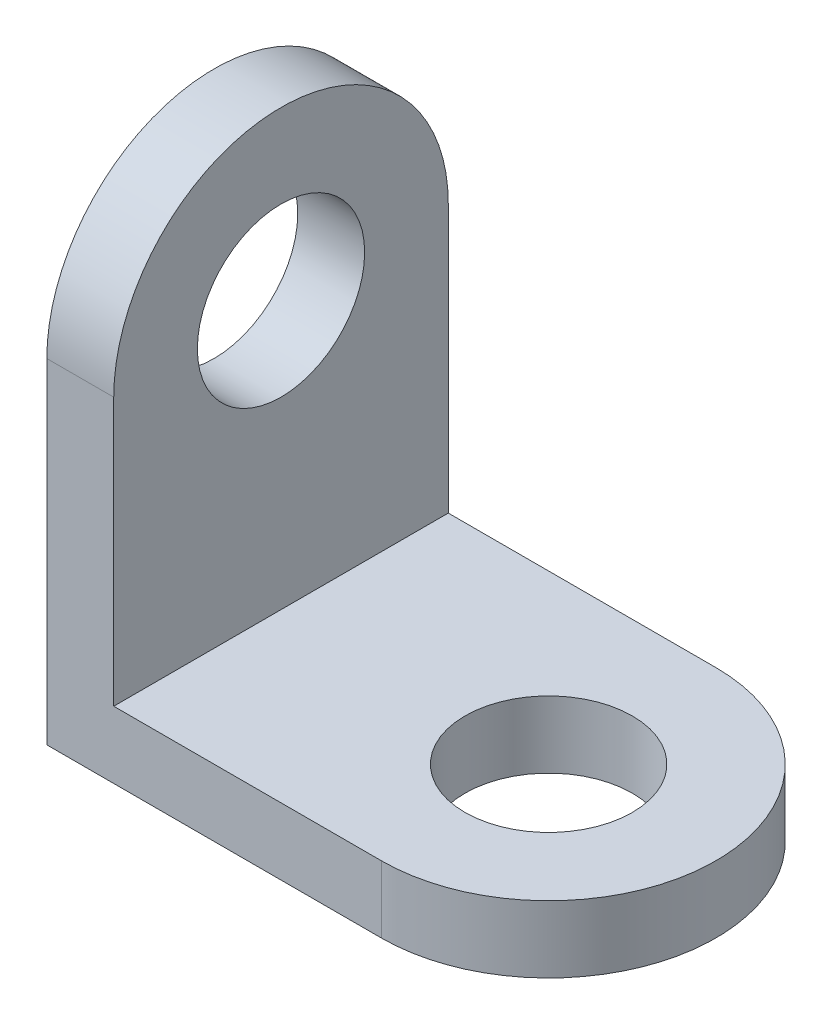
ISO-10303-21;
HEADER;
FILE_DESCRIPTION(('STEP AP214'),'2;1');
FILE_NAME('part.step','',(''),(''),'','','');
FILE_SCHEMA(('AUTOMOTIVE_DESIGN { 1 0 10303 214 1 1 1 1 }'));
ENDSEC;
DATA;
#1=APPLICATION_CONTEXT('core data for automotive mechanical design processes');
#2=APPLICATION_PROTOCOL_DEFINITION('international standard','automotive_design',2000,#1);
#3=PRODUCT_CONTEXT('',#1,'mechanical');
#4=PRODUCT('Part','Part','',(#3));
#5=PRODUCT_RELATED_PRODUCT_CATEGORY('part','',(#4));
#6=PRODUCT_DEFINITION_FORMATION('','',#4);
#7=PRODUCT_DEFINITION_CONTEXT('part definition',#1,'design');
#8=PRODUCT_DEFINITION('design','',#6,#7);
#9=PRODUCT_DEFINITION_SHAPE('','',#8);
#10=(LENGTH_UNIT() NAMED_UNIT(*) SI_UNIT(.MILLI.,.METRE.));
#11=(NAMED_UNIT(*) PLANE_ANGLE_UNIT() SI_UNIT($,.RADIAN.));
#12=(NAMED_UNIT(*) SI_UNIT($,.STERADIAN.) SOLID_ANGLE_UNIT());
#13=UNCERTAINTY_MEASURE_WITH_UNIT(LENGTH_MEASURE(1.E-05),#10,'distance_accuracy_value','');
#14=(GEOMETRIC_REPRESENTATION_CONTEXT(3) GLOBAL_UNCERTAINTY_ASSIGNED_CONTEXT((#13)) GLOBAL_UNIT_ASSIGNED_CONTEXT((#10,
#11,#12)) REPRESENTATION_CONTEXT('',''));
#15=CARTESIAN_POINT('',(0.,0.,0.));
#16=DIRECTION('',(0.,0.,1.));
#17=DIRECTION('',(1.,0.,0.));
#18=AXIS2_PLACEMENT_3D('',#15,#16,#17);
#19=CARTESIAN_POINT('',(0.,2.,0.));
#20=DIRECTION('',(0.,1.,0.));
#21=DIRECTION('',(0.,0.,1.));
#22=AXIS2_PLACEMENT_3D('',#19,#20,#21);
#23=PLANE('',#22);
#24=DIRECTION('',(0.,0.,-1.));
#25=VECTOR('',#24,1.);
#26=CARTESIAN_POINT('',(-8.,2.,0.));
#27=LINE('',#26,#25);
#28=CARTESIAN_POINT('',(-8.,2.,5.));
#29=VERTEX_POINT('',#28);
#30=CARTESIAN_POINT('',(-8.,2.,-5.));
#31=VERTEX_POINT('',#30);
#32=EDGE_CURVE('E66',#29,#31,#27,.T.);
#33=ORIENTED_EDGE('',*,*,#32,.F.);
#34=DIRECTION('',(1.,0.,0.));
#35=VECTOR('',#34,1.);
#36=CARTESIAN_POINT('',(0.,2.,5.));
#37=LINE('',#36,#35);
#38=CARTESIAN_POINT('',(0.,2.,5.));
#39=VERTEX_POINT('',#38);
#40=EDGE_CURVE('E105',#29,#39,#37,.T.);
#41=ORIENTED_EDGE('',*,*,#40,.T.);
#42=CARTESIAN_POINT('',(0.,2.,0.));
#43=DIRECTION('',(0.,1.,0.));
#44=DIRECTION('',(0.,0.,1.));
#45=AXIS2_PLACEMENT_3D('',#42,#43,#44);
#46=CIRCLE('',#45,5.);
#47=CARTESIAN_POINT('',(0.,2.,-5.));
#48=VERTEX_POINT('',#47);
#49=EDGE_CURVE('E72',#39,#48,#46,.T.);
#50=ORIENTED_EDGE('',*,*,#49,.T.);
#51=DIRECTION('',(-1.,0.,0.));
#52=VECTOR('',#51,1.);
#53=CARTESIAN_POINT('',(0.,2.,-5.));
#54=LINE('',#53,#52);
#55=EDGE_CURVE('E116',#48,#31,#54,.T.);
#56=ORIENTED_EDGE('',*,*,#55,.T.);
#57=EDGE_LOOP('',(#33,#41,#50,#56));
#58=FACE_BOUND('',#57,.T.);
#59=CARTESIAN_POINT('',(0.,2.,0.));
#60=DIRECTION('',(0.,1.,0.));
#61=DIRECTION('',(0.,0.,1.));
#62=AXIS2_PLACEMENT_3D('',#59,#60,#61);
#63=CIRCLE('',#62,2.5);
#64=CARTESIAN_POINT('',(0.,2.,2.5));
#65=VERTEX_POINT('',#64);
#66=EDGE_CURVE('E121',#65,#65,#63,.T.);
#67=ORIENTED_EDGE('',*,*,#66,.F.);
#68=EDGE_LOOP('',(#67));
#69=FACE_BOUND('',#68,.T.);
#70=ADVANCED_FACE('F49',(#58,#69),#23,.T.);
#71=CARTESIAN_POINT('',(0.,0.,0.));
#72=DIRECTION('',(0.,1.,0.));
#73=DIRECTION('',(0.,0.,1.));
#74=AXIS2_PLACEMENT_3D('',#71,#72,#73);
#75=PLANE('',#74);
#76=DIRECTION('',(1.,0.,0.));
#77=VECTOR('',#76,1.);
#78=CARTESIAN_POINT('',(0.,0.,5.));
#79=LINE('',#78,#77);
#80=CARTESIAN_POINT('',(-10.,0.,5.));
#81=VERTEX_POINT('',#80);
#82=CARTESIAN_POINT('',(0.,0.,5.));
#83=VERTEX_POINT('',#82);
#84=EDGE_CURVE('E111',#81,#83,#79,.T.);
#85=ORIENTED_EDGE('',*,*,#84,.F.);
#86=DIRECTION('',(0.,0.,1.));
#87=VECTOR('',#86,1.);
#88=CARTESIAN_POINT('',(-10.,0.,0.));
#89=LINE('',#88,#87);
#90=CARTESIAN_POINT('',(-10.,0.,-5.));
#91=VERTEX_POINT('',#90);
#92=EDGE_CURVE('E92',#91,#81,#89,.T.);
#93=ORIENTED_EDGE('',*,*,#92,.F.);
#94=DIRECTION('',(-1.,0.,0.));
#95=VECTOR('',#94,1.);
#96=CARTESIAN_POINT('',(0.,0.,-5.));
#97=LINE('',#96,#95);
#98=CARTESIAN_POINT('',(0.,0.,-5.));
#99=VERTEX_POINT('',#98);
#100=EDGE_CURVE('E106',#99,#91,#97,.T.);
#101=ORIENTED_EDGE('',*,*,#100,.F.);
#102=CARTESIAN_POINT('',(0.,0.,0.));
#103=DIRECTION('',(0.,1.,0.));
#104=DIRECTION('',(0.,0.,1.));
#105=AXIS2_PLACEMENT_3D('',#102,#103,#104);
#106=CIRCLE('',#105,5.);
#107=EDGE_CURVE('E120',#83,#99,#106,.T.);
#108=ORIENTED_EDGE('',*,*,#107,.F.);
#109=EDGE_LOOP('',(#85,#93,#101,#108));
#110=FACE_BOUND('',#109,.T.);
#111=CARTESIAN_POINT('',(0.,0.,0.));
#112=DIRECTION('',(0.,1.,0.));
#113=DIRECTION('',(0.,0.,1.));
#114=AXIS2_PLACEMENT_3D('',#111,#112,#113);
#115=CIRCLE('',#114,2.5);
#116=CARTESIAN_POINT('',(0.,0.,2.5));
#117=VERTEX_POINT('',#116);
#118=EDGE_CURVE('E125',#117,#117,#115,.T.);
#119=ORIENTED_EDGE('',*,*,#118,.T.);
#120=EDGE_LOOP('',(#119));
#121=FACE_BOUND('',#120,.T.);
#122=ADVANCED_FACE('F118',(#110,#121),#75,.F.);
#123=CARTESIAN_POINT('',(0.,2.,5.));
#124=DIRECTION('',(0.,0.,-1.));
#125=DIRECTION('',(-1.,0.,0.));
#126=AXIS2_PLACEMENT_3D('',#123,#124,#125);
#127=PLANE('',#126);
#128=ORIENTED_EDGE('',*,*,#84,.T.);
#129=DIRECTION('',(0.,-1.,0.));
#130=VECTOR('',#129,1.);
#131=CARTESIAN_POINT('',(0.,2.,5.));
#132=LINE('',#131,#130);
#133=EDGE_CURVE('E12',#39,#83,#132,.T.);
#134=ORIENTED_EDGE('',*,*,#133,.F.);
#135=ORIENTED_EDGE('',*,*,#40,.F.);
#136=DIRECTION('',(0.,-1.,0.));
#137=VECTOR('',#136,1.);
#138=CARTESIAN_POINT('',(-8.,0.,5.));
#139=LINE('',#138,#137);
#140=CARTESIAN_POINT('',(-8.,10.,5.));
#141=VERTEX_POINT('',#140);
#142=EDGE_CURVE('E154',#141,#29,#139,.T.);
#143=ORIENTED_EDGE('',*,*,#142,.F.);
#144=DIRECTION('',(-1.,0.,0.));
#145=VECTOR('',#144,1.);
#146=CARTESIAN_POINT('',(-8.,10.,5.));
#147=LINE('',#146,#145);
#148=CARTESIAN_POINT('',(-10.,10.,5.));
#149=VERTEX_POINT('',#148);
#150=EDGE_CURVE('E114',#141,#149,#147,.T.);
#151=ORIENTED_EDGE('',*,*,#150,.T.);
#152=DIRECTION('',(0.,-1.,0.));
#153=VECTOR('',#152,1.);
#154=CARTESIAN_POINT('',(-10.,2.,5.));
#155=LINE('',#154,#153);
#156=EDGE_CURVE('E98',#149,#81,#155,.T.);
#157=ORIENTED_EDGE('',*,*,#156,.T.);
#158=EDGE_LOOP('',(#128,#134,#135,#143,#151,#157));
#159=FACE_BOUND('',#158,.T.);
#160=ADVANCED_FACE('F51',(#159),#127,.F.);
#161=CARTESIAN_POINT('',(0.,2.,0.));
#162=DIRECTION('',(0.,-1.,0.));
#163=DIRECTION('',(0.,0.,-1.));
#164=AXIS2_PLACEMENT_3D('',#161,#162,#163);
#165=CYLINDRICAL_SURFACE('',#164,5.);
#166=ORIENTED_EDGE('',*,*,#107,.T.);
#167=DIRECTION('',(0.,-1.,0.));
#168=VECTOR('',#167,1.);
#169=CARTESIAN_POINT('',(0.,2.,-5.));
#170=LINE('',#169,#168);
#171=EDGE_CURVE('E58',#48,#99,#170,.T.);
#172=ORIENTED_EDGE('',*,*,#171,.F.);
#173=ORIENTED_EDGE('',*,*,#49,.F.);
#174=ORIENTED_EDGE('',*,*,#133,.T.);
#175=EDGE_LOOP('',(#166,#172,#173,#174));
#176=FACE_BOUND('',#175,.T.);
#177=ADVANCED_FACE('F203',(#176),#165,.T.);
#178=CARTESIAN_POINT('',(0.,2.,-5.));
#179=DIRECTION('',(0.,0.,1.));
#180=DIRECTION('',(1.,0.,0.));
#181=AXIS2_PLACEMENT_3D('',#178,#179,#180);
#182=PLANE('',#181);
#183=ORIENTED_EDGE('',*,*,#100,.T.);
#184=DIRECTION('',(0.,-1.,0.));
#185=VECTOR('',#184,1.);
#186=CARTESIAN_POINT('',(-10.,2.,-5.));
#187=LINE('',#186,#185);
#188=CARTESIAN_POINT('',(-10.,10.,-5.));
#189=VERTEX_POINT('',#188);
#190=EDGE_CURVE('E101',#189,#91,#187,.T.);
#191=ORIENTED_EDGE('',*,*,#190,.F.);
#192=DIRECTION('',(-1.,0.,0.));
#193=VECTOR('',#192,1.);
#194=CARTESIAN_POINT('',(-8.,10.,-5.));
#195=LINE('',#194,#193);
#196=CARTESIAN_POINT('',(-8.,10.,-5.));
#197=VERTEX_POINT('',#196);
#198=EDGE_CURVE('E158',#197,#189,#195,.T.);
#199=ORIENTED_EDGE('',*,*,#198,.F.);
#200=DIRECTION('',(0.,1.,0.));
#201=VECTOR('',#200,1.);
#202=CARTESIAN_POINT('',(-8.,0.,-5.));
#203=LINE('',#202,#201);
#204=EDGE_CURVE('E152',#31,#197,#203,.T.);
#205=ORIENTED_EDGE('',*,*,#204,.F.);
#206=ORIENTED_EDGE('',*,*,#55,.F.);
#207=ORIENTED_EDGE('',*,*,#171,.T.);
#208=EDGE_LOOP('',(#183,#191,#199,#205,#206,#207));
#209=FACE_BOUND('',#208,.T.);
#210=ADVANCED_FACE('F156',(#209),#182,.F.);
#211=CARTESIAN_POINT('',(-10.,2.,0.));
#212=DIRECTION('',(1.,0.,0.));
#213=DIRECTION('',(0.,0.,-1.));
#214=AXIS2_PLACEMENT_3D('',#211,#212,#213);
#215=PLANE('',#214);
#216=ORIENTED_EDGE('',*,*,#92,.T.);
#217=ORIENTED_EDGE('',*,*,#156,.F.);
#218=CARTESIAN_POINT('',(-10.,10.,0.));
#219=DIRECTION('',(-1.,0.,0.));
#220=DIRECTION('',(0.,0.,1.));
#221=AXIS2_PLACEMENT_3D('',#218,#219,#220);
#222=CIRCLE('',#221,5.);
#223=EDGE_CURVE('E168',#149,#189,#222,.T.);
#224=ORIENTED_EDGE('',*,*,#223,.T.);
#225=ORIENTED_EDGE('',*,*,#190,.T.);
#226=EDGE_LOOP('',(#216,#217,#224,#225));
#227=FACE_BOUND('',#226,.T.);
#228=CARTESIAN_POINT('',(-10.,10.,0.));
#229=DIRECTION('',(-1.,0.,0.));
#230=DIRECTION('',(0.,0.,1.));
#231=AXIS2_PLACEMENT_3D('',#228,#229,#230);
#232=CIRCLE('',#231,2.5);
#233=CARTESIAN_POINT('',(-10.,10.,2.5));
#234=VERTEX_POINT('',#233);
#235=EDGE_CURVE('E166',#234,#234,#232,.T.);
#236=ORIENTED_EDGE('',*,*,#235,.F.);
#237=EDGE_LOOP('',(#236));
#238=FACE_BOUND('',#237,.T.);
#239=ADVANCED_FACE('F94',(#227,#238),#215,.F.);
#240=CARTESIAN_POINT('',(0.,2.,0.));
#241=DIRECTION('',(0.,-1.,0.));
#242=DIRECTION('',(0.,0.,-1.));
#243=AXIS2_PLACEMENT_3D('',#240,#241,#242);
#244=CYLINDRICAL_SURFACE('',#243,2.5);
#245=ORIENTED_EDGE('',*,*,#66,.T.);
#246=EDGE_LOOP('',(#245));
#247=FACE_BOUND('',#246,.T.);
#248=ORIENTED_EDGE('',*,*,#118,.F.);
#249=EDGE_LOOP('',(#248));
#250=FACE_BOUND('',#249,.T.);
#251=ADVANCED_FACE('F189',(#247,#250),#244,.F.);
#252=CARTESIAN_POINT('',(-8.,10.,0.));
#253=DIRECTION('',(-1.,0.,0.));
#254=DIRECTION('',(0.,0.,1.));
#255=AXIS2_PLACEMENT_3D('',#252,#253,#254);
#256=CYLINDRICAL_SURFACE('',#255,5.);
#257=ORIENTED_EDGE('',*,*,#223,.F.);
#258=ORIENTED_EDGE('',*,*,#150,.F.);
#259=CARTESIAN_POINT('',(-8.,10.,0.));
#260=DIRECTION('',(-1.,0.,0.));
#261=DIRECTION('',(0.,0.,1.));
#262=AXIS2_PLACEMENT_3D('',#259,#260,#261);
#263=CIRCLE('',#262,5.);
#264=EDGE_CURVE('E160',#141,#197,#263,.T.);
#265=ORIENTED_EDGE('',*,*,#264,.T.);
#266=ORIENTED_EDGE('',*,*,#198,.T.);
#267=EDGE_LOOP('',(#257,#258,#265,#266));
#268=FACE_BOUND('',#267,.T.);
#269=ADVANCED_FACE('F182',(#268),#256,.T.);
#270=CARTESIAN_POINT('',(-8.,10.,0.));
#271=DIRECTION('',(-1.,0.,0.));
#272=DIRECTION('',(0.,0.,1.));
#273=AXIS2_PLACEMENT_3D('',#270,#271,#272);
#274=CYLINDRICAL_SURFACE('',#273,2.5);
#275=CARTESIAN_POINT('',(-8.,10.,0.));
#276=DIRECTION('',(-1.,0.,0.));
#277=DIRECTION('',(0.,0.,1.));
#278=AXIS2_PLACEMENT_3D('',#275,#276,#277);
#279=CIRCLE('',#278,2.5);
#280=CARTESIAN_POINT('',(-8.,10.,2.5));
#281=VERTEX_POINT('',#280);
#282=EDGE_CURVE('E155',#281,#281,#279,.T.);
#283=ORIENTED_EDGE('',*,*,#282,.F.);
#284=EDGE_LOOP('',(#283));
#285=FACE_BOUND('',#284,.T.);
#286=ORIENTED_EDGE('',*,*,#235,.T.);
#287=EDGE_LOOP('',(#286));
#288=FACE_BOUND('',#287,.T.);
#289=ADVANCED_FACE('F180',(#285,#288),#274,.F.);
#290=CARTESIAN_POINT('',(-8.,0.,0.));
#291=DIRECTION('',(-1.,0.,0.));
#292=DIRECTION('',(0.,0.,1.));
#293=AXIS2_PLACEMENT_3D('',#290,#291,#292);
#294=PLANE('',#293);
#295=ORIENTED_EDGE('',*,*,#142,.T.);
#296=ORIENTED_EDGE('',*,*,#32,.T.);
#297=ORIENTED_EDGE('',*,*,#204,.T.);
#298=ORIENTED_EDGE('',*,*,#264,.F.);
#299=EDGE_LOOP('',(#295,#296,#297,#298));
#300=FACE_BOUND('',#299,.T.);
#301=ORIENTED_EDGE('',*,*,#282,.T.);
#302=EDGE_LOOP('',(#301));
#303=FACE_BOUND('',#302,.T.);
#304=ADVANCED_FACE('F149',(#300,#303),#294,.F.);
#305=CLOSED_SHELL('',(#70,#122,#160,#177,#210,#239,#251,#269,#289,#304));
#306=MANIFOLD_SOLID_BREP('B2',#305);
#307=ADVANCED_BREP_SHAPE_REPRESENTATION('',(#18,#306),#14);
#308=SHAPE_DEFINITION_REPRESENTATION(#9,#307);
ENDSEC;
END-ISO-10303-21;
